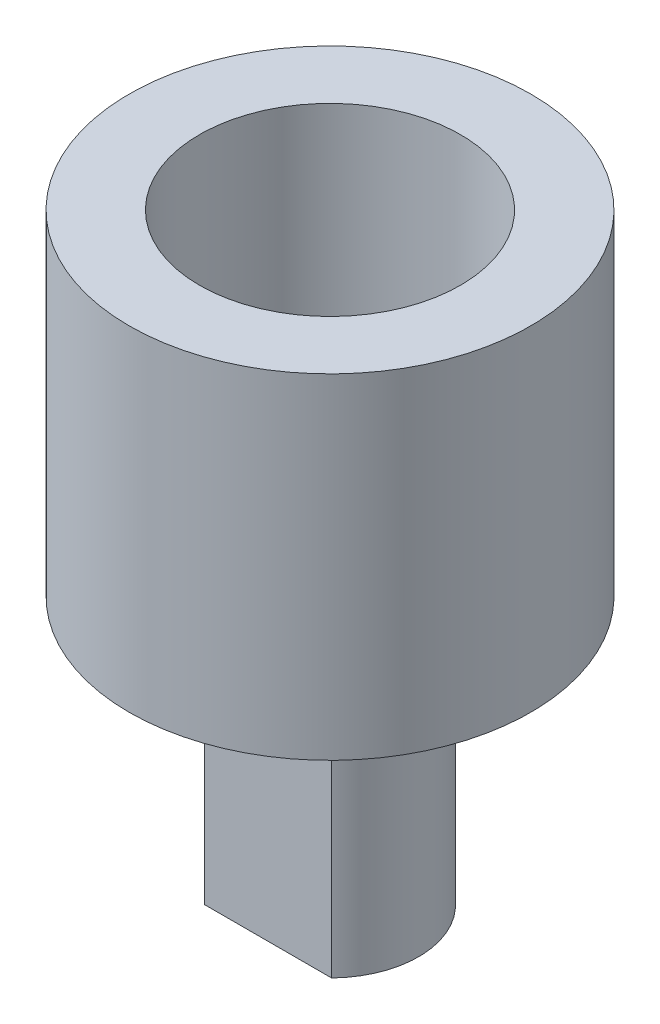
ISO-10303-21;
HEADER;
FILE_DESCRIPTION(('STEP AP214'),'2;1');
FILE_NAME('part.step','',(''),(''),'','','');
FILE_SCHEMA(('AUTOMOTIVE_DESIGN { 1 0 10303 214 1 1 1 1 }'));
ENDSEC;
DATA;
#1=APPLICATION_CONTEXT('core data for automotive mechanical design processes');
#2=APPLICATION_PROTOCOL_DEFINITION('international standard','automotive_design',2000,#1);
#3=PRODUCT_CONTEXT('',#1,'mechanical');
#4=PRODUCT('Part','Part','',(#3));
#5=PRODUCT_RELATED_PRODUCT_CATEGORY('part','',(#4));
#6=PRODUCT_DEFINITION_FORMATION('','',#4);
#7=PRODUCT_DEFINITION_CONTEXT('part definition',#1,'design');
#8=PRODUCT_DEFINITION('design','',#6,#7);
#9=PRODUCT_DEFINITION_SHAPE('','',#8);
#10=(LENGTH_UNIT() NAMED_UNIT(*) SI_UNIT(.MILLI.,.METRE.));
#11=(NAMED_UNIT(*) PLANE_ANGLE_UNIT() SI_UNIT($,.RADIAN.));
#12=(NAMED_UNIT(*) SI_UNIT($,.STERADIAN.) SOLID_ANGLE_UNIT());
#13=UNCERTAINTY_MEASURE_WITH_UNIT(LENGTH_MEASURE(1.E-05),#10,'distance_accuracy_value','');
#14=(GEOMETRIC_REPRESENTATION_CONTEXT(3) GLOBAL_UNCERTAINTY_ASSIGNED_CONTEXT((#13)) GLOBAL_UNIT_ASSIGNED_CONTEXT((#10,
#11,#12)) REPRESENTATION_CONTEXT('',''));
#15=CARTESIAN_POINT('',(0.,0.,0.));
#16=DIRECTION('',(0.,0.,1.));
#17=DIRECTION('',(1.,0.,0.));
#18=AXIS2_PLACEMENT_3D('',#15,#16,#17);
#19=CARTESIAN_POINT('',(0.,0.,0.));
#20=DIRECTION('',(0.,1.,0.));
#21=DIRECTION('',(0.,0.,1.));
#22=AXIS2_PLACEMENT_3D('',#19,#20,#21);
#23=PLANE('',#22);
#24=CARTESIAN_POINT('',(0.,0.,0.));
#25=DIRECTION('',(0.,1.,0.));
#26=DIRECTION('',(0.,0.,1.));
#27=AXIS2_PLACEMENT_3D('',#24,#25,#26);
#28=CIRCLE('',#27,6.);
#29=CARTESIAN_POINT('',(0.,0.,6.));
#30=VERTEX_POINT('',#29);
#31=EDGE_CURVE('E48',#30,#30,#28,.T.);
#32=ORIENTED_EDGE('',*,*,#31,.F.);
#33=EDGE_LOOP('',(#32));
#34=FACE_BOUND('',#33,.T.);
#35=CARTESIAN_POINT('',(0.,0.,0.));
#36=DIRECTION('',(0.,-1.,0.));
#37=DIRECTION('',(0.,0.,-1.));
#38=AXIS2_PLACEMENT_3D('',#35,#36,#37);
#39=CIRCLE('',#38,2.65);
#40=CARTESIAN_POINT('',(-1.89736659610103,0.,1.85));
#41=VERTEX_POINT('',#40);
#42=CARTESIAN_POINT('',(-1.94486503387767,0.,-1.8));
#43=VERTEX_POINT('',#42);
#44=EDGE_CURVE('E55',#41,#43,#39,.T.);
#45=ORIENTED_EDGE('',*,*,#44,.F.);
#46=DIRECTION('',(-1.,0.,0.));
#47=VECTOR('',#46,1.);
#48=CARTESIAN_POINT('',(-1.89736659610103,0.,1.85));
#49=LINE('',#48,#47);
#50=CARTESIAN_POINT('',(1.89736659610103,0.,1.85));
#51=VERTEX_POINT('',#50);
#52=EDGE_CURVE('E59',#51,#41,#49,.T.);
#53=ORIENTED_EDGE('',*,*,#52,.F.);
#54=CARTESIAN_POINT('',(0.,0.,0.));
#55=DIRECTION('',(0.,-1.,0.));
#56=DIRECTION('',(0.,0.,-1.));
#57=AXIS2_PLACEMENT_3D('',#54,#55,#56);
#58=CIRCLE('',#57,2.65);
#59=CARTESIAN_POINT('',(1.94486503387767,0.,-1.8));
#60=VERTEX_POINT('',#59);
#61=EDGE_CURVE('E218',#60,#51,#58,.T.);
#62=ORIENTED_EDGE('',*,*,#61,.F.);
#63=DIRECTION('',(1.,0.,0.));
#64=VECTOR('',#63,1.);
#65=CARTESIAN_POINT('',(-1.94486503387767,0.,-1.8));
#66=LINE('',#65,#64);
#67=EDGE_CURVE('E228',#43,#60,#66,.T.);
#68=ORIENTED_EDGE('',*,*,#67,.F.);
#69=EDGE_LOOP('',(#45,#53,#62,#68));
#70=FACE_BOUND('',#69,.T.);
#71=ADVANCED_FACE('F39',(#34,#70),#23,.F.);
#72=CARTESIAN_POINT('',(0.,2.,0.));
#73=DIRECTION('',(0.,-1.,0.));
#74=DIRECTION('',(0.,0.,-1.));
#75=AXIS2_PLACEMENT_3D('',#72,#73,#74);
#76=CYLINDRICAL_SURFACE('',#75,6.);
#77=ORIENTED_EDGE('',*,*,#31,.T.);
#78=EDGE_LOOP('',(#77));
#79=FACE_BOUND('',#78,.T.);
#80=CARTESIAN_POINT('',(0.,10.,0.));
#81=DIRECTION('',(0.,1.,0.));
#82=DIRECTION('',(0.,0.,1.));
#83=AXIS2_PLACEMENT_3D('',#80,#81,#82);
#84=CIRCLE('',#83,6.);
#85=CARTESIAN_POINT('',(0.,10.,6.));
#86=VERTEX_POINT('',#85);
#87=EDGE_CURVE('E109',#86,#86,#84,.T.);
#88=ORIENTED_EDGE('',*,*,#87,.F.);
#89=EDGE_LOOP('',(#88));
#90=FACE_BOUND('',#89,.T.);
#91=ADVANCED_FACE('F41',(#79,#90),#76,.T.);
#92=CARTESIAN_POINT('',(0.,10.,0.));
#93=DIRECTION('',(0.,1.,0.));
#94=DIRECTION('',(0.,0.,1.));
#95=AXIS2_PLACEMENT_3D('',#92,#93,#94);
#96=PLANE('',#95);
#97=ORIENTED_EDGE('',*,*,#87,.T.);
#98=EDGE_LOOP('',(#97));
#99=FACE_BOUND('',#98,.T.);
#100=CARTESIAN_POINT('',(0.,10.,0.));
#101=DIRECTION('',(0.,1.,0.));
#102=DIRECTION('',(0.,0.,1.));
#103=AXIS2_PLACEMENT_3D('',#100,#101,#102);
#104=CIRCLE('',#103,3.9);
#105=CARTESIAN_POINT('',(0.,10.,3.9));
#106=VERTEX_POINT('',#105);
#107=EDGE_CURVE('E104',#106,#106,#104,.T.);
#108=ORIENTED_EDGE('',*,*,#107,.F.);
#109=EDGE_LOOP('',(#108));
#110=FACE_BOUND('',#109,.T.);
#111=ADVANCED_FACE('F127',(#99,#110),#96,.T.);
#112=CARTESIAN_POINT('',(0.,10.,0.));
#113=DIRECTION('',(0.,-1.,0.));
#114=DIRECTION('',(0.,0.,-1.));
#115=AXIS2_PLACEMENT_3D('',#112,#113,#114);
#116=CYLINDRICAL_SURFACE('',#115,3.9);
#117=ORIENTED_EDGE('',*,*,#107,.T.);
#118=EDGE_LOOP('',(#117));
#119=FACE_BOUND('',#118,.T.);
#120=CARTESIAN_POINT('',(0.,2.,0.));
#121=DIRECTION('',(0.,1.,0.));
#122=DIRECTION('',(0.,0.,1.));
#123=AXIS2_PLACEMENT_3D('',#120,#121,#122);
#124=CIRCLE('',#123,3.9);
#125=CARTESIAN_POINT('',(0.,2.,3.9));
#126=VERTEX_POINT('',#125);
#127=EDGE_CURVE('E11',#126,#126,#124,.F.);
#128=ORIENTED_EDGE('',*,*,#127,.T.);
#129=EDGE_LOOP('',(#128));
#130=FACE_BOUND('',#129,.T.);
#131=ADVANCED_FACE('F132',(#119,#130),#116,.F.);
#132=CARTESIAN_POINT('',(0.,2.,0.));
#133=DIRECTION('',(0.,1.,0.));
#134=DIRECTION('',(0.,0.,1.));
#135=AXIS2_PLACEMENT_3D('',#132,#133,#134);
#136=PLANE('',#135);
#137=ORIENTED_EDGE('',*,*,#127,.F.);
#138=EDGE_LOOP('',(#137));
#139=FACE_BOUND('',#138,.T.);
#140=ADVANCED_FACE('F129',(#139),#136,.T.);
#141=CARTESIAN_POINT('',(0.,-8.,0.));
#142=DIRECTION('',(0.,1.,0.));
#143=DIRECTION('',(0.,0.,1.));
#144=AXIS2_PLACEMENT_3D('',#141,#142,#143);
#145=CYLINDRICAL_SURFACE('',#144,2.65);
#146=ORIENTED_EDGE('',*,*,#44,.T.);
#147=DIRECTION('',(0.,1.,0.));
#148=VECTOR('',#147,1.);
#149=CARTESIAN_POINT('',(-1.94486503387767,-8.,-1.8));
#150=LINE('',#149,#148);
#151=CARTESIAN_POINT('',(-1.94486503387767,-8.,-1.8));
#152=VERTEX_POINT('',#151);
#153=EDGE_CURVE('E84',#152,#43,#150,.T.);
#154=ORIENTED_EDGE('',*,*,#153,.F.);
#155=CARTESIAN_POINT('',(0.,-8.,0.));
#156=DIRECTION('',(0.,-1.,0.));
#157=DIRECTION('',(0.,0.,-1.));
#158=AXIS2_PLACEMENT_3D('',#155,#156,#157);
#159=CIRCLE('',#158,2.65);
#160=CARTESIAN_POINT('',(-1.89736659610103,-8.,1.85));
#161=VERTEX_POINT('',#160);
#162=EDGE_CURVE('E91',#161,#152,#159,.T.);
#163=ORIENTED_EDGE('',*,*,#162,.F.);
#164=DIRECTION('',(0.,1.,0.));
#165=VECTOR('',#164,1.);
#166=CARTESIAN_POINT('',(-1.89736659610103,-8.,1.85));
#167=LINE('',#166,#165);
#168=EDGE_CURVE('E215',#161,#41,#167,.T.);
#169=ORIENTED_EDGE('',*,*,#168,.T.);
#170=EDGE_LOOP('',(#146,#154,#163,#169));
#171=FACE_BOUND('',#170,.T.);
#172=ADVANCED_FACE('F102',(#171),#145,.T.);
#173=CARTESIAN_POINT('',(-1.94486503387767,-8.,-1.8));
#174=DIRECTION('',(0.,0.,1.));
#175=DIRECTION('',(1.,0.,0.));
#176=AXIS2_PLACEMENT_3D('',#173,#174,#175);
#177=PLANE('',#176);
#178=ORIENTED_EDGE('',*,*,#67,.T.);
#179=DIRECTION('',(0.,1.,0.));
#180=VECTOR('',#179,1.);
#181=CARTESIAN_POINT('',(1.94486503387767,-8.,-1.8));
#182=LINE('',#181,#180);
#183=CARTESIAN_POINT('',(1.94486503387767,-8.,-1.8));
#184=VERTEX_POINT('',#183);
#185=EDGE_CURVE('E86',#184,#60,#182,.T.);
#186=ORIENTED_EDGE('',*,*,#185,.F.);
#187=DIRECTION('',(1.,0.,0.));
#188=VECTOR('',#187,1.);
#189=CARTESIAN_POINT('',(-1.94486503387767,-8.,-1.8));
#190=LINE('',#189,#188);
#191=EDGE_CURVE('E79',#152,#184,#190,.T.);
#192=ORIENTED_EDGE('',*,*,#191,.F.);
#193=ORIENTED_EDGE('',*,*,#153,.T.);
#194=EDGE_LOOP('',(#178,#186,#192,#193));
#195=FACE_BOUND('',#194,.T.);
#196=ADVANCED_FACE('F82',(#195),#177,.F.);
#197=CARTESIAN_POINT('',(0.,-8.,0.));
#198=DIRECTION('',(0.,1.,0.));
#199=DIRECTION('',(0.,0.,1.));
#200=AXIS2_PLACEMENT_3D('',#197,#198,#199);
#201=CYLINDRICAL_SURFACE('',#200,2.65);
#202=ORIENTED_EDGE('',*,*,#61,.T.);
#203=DIRECTION('',(0.,1.,0.));
#204=VECTOR('',#203,1.);
#205=CARTESIAN_POINT('',(1.89736659610103,-8.,1.85));
#206=LINE('',#205,#204);
#207=CARTESIAN_POINT('',(1.89736659610103,-8.,1.85));
#208=VERTEX_POINT('',#207);
#209=EDGE_CURVE('E111',#208,#51,#206,.T.);
#210=ORIENTED_EDGE('',*,*,#209,.F.);
#211=CARTESIAN_POINT('',(0.,-8.,0.));
#212=DIRECTION('',(0.,-1.,0.));
#213=DIRECTION('',(0.,0.,-1.));
#214=AXIS2_PLACEMENT_3D('',#211,#212,#213);
#215=CIRCLE('',#214,2.65);
#216=EDGE_CURVE('E90',#184,#208,#215,.T.);
#217=ORIENTED_EDGE('',*,*,#216,.F.);
#218=ORIENTED_EDGE('',*,*,#185,.T.);
#219=EDGE_LOOP('',(#202,#210,#217,#218));
#220=FACE_BOUND('',#219,.T.);
#221=ADVANCED_FACE('F144',(#220),#201,.T.);
#222=CARTESIAN_POINT('',(-1.89736659610103,-8.,1.85));
#223=DIRECTION('',(0.,0.,-1.));
#224=DIRECTION('',(-1.,0.,0.));
#225=AXIS2_PLACEMENT_3D('',#222,#223,#224);
#226=PLANE('',#225);
#227=ORIENTED_EDGE('',*,*,#52,.T.);
#228=ORIENTED_EDGE('',*,*,#168,.F.);
#229=DIRECTION('',(-1.,0.,0.));
#230=VECTOR('',#229,1.);
#231=CARTESIAN_POINT('',(-1.89736659610103,-8.,1.85));
#232=LINE('',#231,#230);
#233=EDGE_CURVE('E96',#208,#161,#232,.T.);
#234=ORIENTED_EDGE('',*,*,#233,.F.);
#235=ORIENTED_EDGE('',*,*,#209,.T.);
#236=EDGE_LOOP('',(#227,#228,#234,#235));
#237=FACE_BOUND('',#236,.T.);
#238=ADVANCED_FACE('F147',(#237),#226,.F.);
#239=CARTESIAN_POINT('',(0.,-8.,0.));
#240=DIRECTION('',(0.,-1.,0.));
#241=DIRECTION('',(0.,0.,-1.));
#242=AXIS2_PLACEMENT_3D('',#239,#240,#241);
#243=PLANE('',#242);
#244=ORIENTED_EDGE('',*,*,#162,.T.);
#245=ORIENTED_EDGE('',*,*,#191,.T.);
#246=ORIENTED_EDGE('',*,*,#216,.T.);
#247=ORIENTED_EDGE('',*,*,#233,.T.);
#248=EDGE_LOOP('',(#244,#245,#246,#247));
#249=FACE_BOUND('',#248,.T.);
#250=ADVANCED_FACE('F94',(#249),#243,.T.);
#251=CLOSED_SHELL('',(#71,#91,#111,#131,#140,#172,#196,#221,#238,#250));
#252=MANIFOLD_SOLID_BREP('B2',#251);
#253=ADVANCED_BREP_SHAPE_REPRESENTATION('',(#18,#252),#14);
#254=SHAPE_DEFINITION_REPRESENTATION(#9,#253);
ENDSEC;
END-ISO-10303-21;
